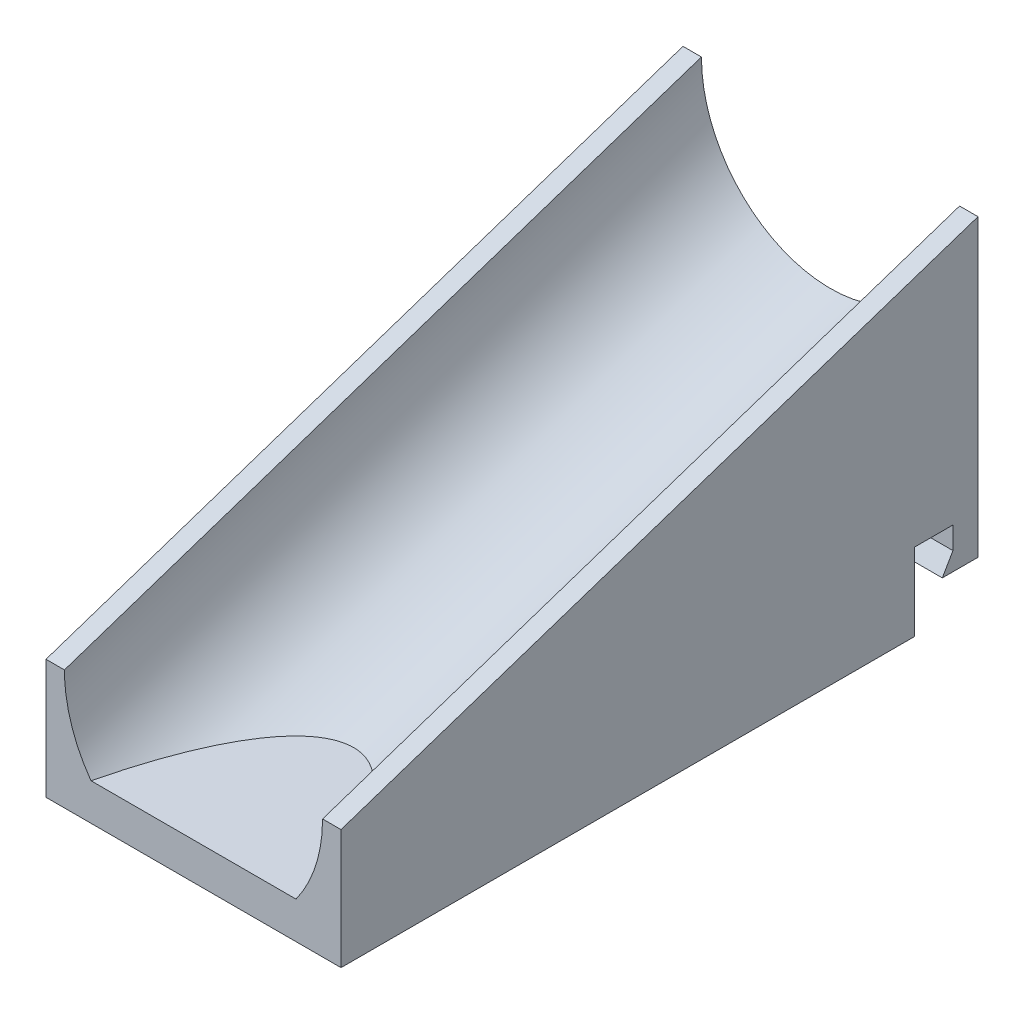
ISO-10303-21;
HEADER;
FILE_DESCRIPTION(('STEP AP214'),'2;1');
FILE_NAME('part.step','',(''),(''),'','','');
FILE_SCHEMA(('AUTOMOTIVE_DESIGN { 1 0 10303 214 1 1 1 1 }'));
ENDSEC;
DATA;
#1=APPLICATION_CONTEXT('core data for automotive mechanical design processes');
#2=APPLICATION_PROTOCOL_DEFINITION('international standard','automotive_design',2000,#1);
#3=PRODUCT_CONTEXT('',#1,'mechanical');
#4=PRODUCT('Part','Part','',(#3));
#5=PRODUCT_RELATED_PRODUCT_CATEGORY('part','',(#4));
#6=PRODUCT_DEFINITION_FORMATION('','',#4);
#7=PRODUCT_DEFINITION_CONTEXT('part definition',#1,'design');
#8=PRODUCT_DEFINITION('design','',#6,#7);
#9=PRODUCT_DEFINITION_SHAPE('','',#8);
#10=(LENGTH_UNIT() NAMED_UNIT(*) SI_UNIT(.MILLI.,.METRE.));
#11=(NAMED_UNIT(*) PLANE_ANGLE_UNIT() SI_UNIT($,.RADIAN.));
#12=(NAMED_UNIT(*) SI_UNIT($,.STERADIAN.) SOLID_ANGLE_UNIT());
#13=UNCERTAINTY_MEASURE_WITH_UNIT(LENGTH_MEASURE(1.E-05),#10,'distance_accuracy_value','');
#14=(GEOMETRIC_REPRESENTATION_CONTEXT(3) GLOBAL_UNCERTAINTY_ASSIGNED_CONTEXT((#13)) GLOBAL_UNIT_ASSIGNED_CONTEXT((#10,
#11,#12)) REPRESENTATION_CONTEXT('',''));
#15=CARTESIAN_POINT('',(0.,0.,0.));
#16=DIRECTION('',(0.,0.,1.));
#17=DIRECTION('',(1.,0.,0.));
#18=AXIS2_PLACEMENT_3D('',#15,#16,#17);
#19=CARTESIAN_POINT('',(-50.8,0.,8.63600000000002));
#20=DIRECTION('',(0.,0.,-1.));
#21=DIRECTION('',(-1.,0.,0.));
#22=AXIS2_PLACEMENT_3D('',#19,#20,#21);
#23=PLANE('',#22);
#24=DIRECTION('',(0.,1.,0.));
#25=VECTOR('',#24,1.);
#26=CARTESIAN_POINT('',(0.,101.6,8.63600000000001));
#27=LINE('',#26,#25);
#28=CARTESIAN_POINT('',(0.,6.32508864231611,8.63600000000001));
#29=VERTEX_POINT('',#28);
#30=CARTESIAN_POINT('',(0.,13.97,8.63600000000001));
#31=VERTEX_POINT('',#30);
#32=EDGE_CURVE('E69',#29,#31,#27,.T.);
#33=ORIENTED_EDGE('',*,*,#32,.F.);
#34=DIRECTION('',(1.,0.,0.));
#35=VECTOR('',#34,1.);
#36=CARTESIAN_POINT('',(-50.8,6.3250886423161,8.63600000000002));
#37=LINE('',#36,#35);
#38=CARTESIAN_POINT('',(101.6,6.32508864231613,8.636));
#39=VERTEX_POINT('',#38);
#40=EDGE_CURVE('E11',#29,#39,#37,.T.);
#41=ORIENTED_EDGE('',*,*,#40,.T.);
#42=DIRECTION('',(0.,1.,0.));
#43=VECTOR('',#42,1.);
#44=CARTESIAN_POINT('',(101.6,0.,8.636));
#45=LINE('',#44,#43);
#46=CARTESIAN_POINT('',(101.6,13.97,8.636));
#47=VERTEX_POINT('',#46);
#48=EDGE_CURVE('E60',#39,#47,#45,.T.);
#49=ORIENTED_EDGE('',*,*,#48,.T.);
#50=DIRECTION('',(1.,0.,0.));
#51=VECTOR('',#50,1.);
#52=CARTESIAN_POINT('',(-50.8,13.97,8.63600000000002));
#53=LINE('',#52,#51);
#54=EDGE_CURVE('E168',#31,#47,#53,.T.);
#55=ORIENTED_EDGE('',*,*,#54,.F.);
#56=EDGE_LOOP('',(#33,#41,#49,#55));
#57=FACE_BOUND('',#56,.T.);
#58=ADVANCED_FACE('F35',(#57),#23,.F.);
#59=CARTESIAN_POINT('',(0.,0.,304.8));
#60=DIRECTION('',(0.,-0.948683298050514,-0.316227766016838));
#61=DIRECTION('',(0.,0.316227766016838,-0.948683298050514));
#62=AXIS2_PLACEMENT_3D('',#59,#60,#61);
#63=PLANE('',#62);
#64=DIRECTION('',(0.,0.316227766016838,-0.948683298050514));
#65=VECTOR('',#64,1.);
#66=CARTESIAN_POINT('',(0.,0.,304.8));
#67=LINE('',#66,#65);
#68=CARTESIAN_POINT('',(0.,28.4777714986456,219.366685504063));
#69=VERTEX_POINT('',#68);
#70=CARTESIAN_POINT('',(0.,101.6,0.));
#71=VERTEX_POINT('',#70);
#72=EDGE_CURVE('E186',#69,#71,#67,.T.);
#73=ORIENTED_EDGE('',*,*,#72,.F.);
#74=DIRECTION('',(1.,0.,0.));
#75=VECTOR('',#74,1.);
#76=CARTESIAN_POINT('',(0.,28.4777714986456,219.366685504063));
#77=LINE('',#76,#75);
#78=CARTESIAN_POINT('',(6.35000000000002,28.4777714986456,219.366685504063));
#79=VERTEX_POINT('',#78);
#80=EDGE_CURVE('E153',#69,#79,#77,.T.);
#81=ORIENTED_EDGE('',*,*,#80,.T.);
#82=DIRECTION('',(0.,0.316227766016838,-0.948683298050514));
#83=VECTOR('',#82,1.);
#84=CARTESIAN_POINT('',(6.35000000000005,-59.0437051365537,481.931115409661));
#85=LINE('',#84,#83);
#86=CARTESIAN_POINT('',(6.34999999999999,101.6,0.));
#87=VERTEX_POINT('',#86);
#88=EDGE_CURVE('E209',#79,#87,#85,.T.);
#89=ORIENTED_EDGE('',*,*,#88,.T.);
#90=DIRECTION('',(-1.,0.,0.));
#91=VECTOR('',#90,1.);
#92=CARTESIAN_POINT('',(0.,101.6,0.));
#93=LINE('',#92,#91);
#94=EDGE_CURVE('E194',#87,#71,#93,.T.);
#95=ORIENTED_EDGE('',*,*,#94,.T.);
#96=EDGE_LOOP('',(#73,#81,#89,#95));
#97=FACE_BOUND('',#96,.T.);
#98=ADVANCED_FACE('F232',(#97),#63,.F.);
#99=CARTESIAN_POINT('',(0.,101.6,0.));
#100=DIRECTION('',(1.,0.,0.));
#101=DIRECTION('',(0.,0.,-1.));
#102=AXIS2_PLACEMENT_3D('',#99,#100,#101);
#103=PLANE('',#102);
#104=DIRECTION('',(0.,0.,-1.));
#105=VECTOR('',#104,1.);
#106=CARTESIAN_POINT('',(0.,-12.7,21.790000108));
#107=LINE('',#106,#105);
#108=CARTESIAN_POINT('',(0.,-12.7,219.366685504063));
#109=VERTEX_POINT('',#108);
#110=CARTESIAN_POINT('',(0.,-12.7,21.790000108));
#111=VERTEX_POINT('',#110);
#112=EDGE_CURVE('E152',#109,#111,#107,.T.);
#113=ORIENTED_EDGE('',*,*,#112,.F.);
#114=DIRECTION('',(0.,-1.,0.));
#115=VECTOR('',#114,1.);
#116=CARTESIAN_POINT('',(0.,45.72,219.366685504063));
#117=LINE('',#116,#115);
#118=EDGE_CURVE('E51',#69,#109,#117,.T.);
#119=ORIENTED_EDGE('',*,*,#118,.F.);
#120=ORIENTED_EDGE('',*,*,#72,.T.);
#121=DIRECTION('',(0.,-1.,0.));
#122=VECTOR('',#121,1.);
#123=CARTESIAN_POINT('',(0.,101.6,0.));
#124=LINE('',#123,#122);
#125=CARTESIAN_POINT('',(0.,0.,0.));
#126=VERTEX_POINT('',#125);
#127=EDGE_CURVE('E193',#71,#126,#124,.T.);
#128=ORIENTED_EDGE('',*,*,#127,.T.);
#129=DIRECTION('',(0.,0.,1.));
#130=VECTOR('',#129,1.);
#131=CARTESIAN_POINT('',(0.,0.,0.));
#132=LINE('',#131,#130);
#133=CARTESIAN_POINT('',(0.,0.,12.2877916302894));
#134=VERTEX_POINT('',#133);
#135=EDGE_CURVE('E188',#126,#134,#132,.T.);
#136=ORIENTED_EDGE('',*,*,#135,.T.);
#137=DIRECTION('',(0.,0.866025403784441,-0.499999999999996));
#138=VECTOR('',#137,1.);
#139=CARTESIAN_POINT('',(0.,-4.67343398574636,14.986));
#140=LINE('',#139,#138);
#141=EDGE_CURVE('E76',#134,#29,#140,.T.);
#142=ORIENTED_EDGE('',*,*,#141,.T.);
#143=ORIENTED_EDGE('',*,*,#32,.T.);
#144=DIRECTION('',(0.,0.,1.));
#145=VECTOR('',#144,1.);
#146=CARTESIAN_POINT('',(0.,13.97,0.));
#147=LINE('',#146,#145);
#148=CARTESIAN_POINT('',(0.,13.97,21.790000108));
#149=VERTEX_POINT('',#148);
#150=EDGE_CURVE('E177',#31,#149,#147,.T.);
#151=ORIENTED_EDGE('',*,*,#150,.T.);
#152=DIRECTION('',(0.,-1.,0.));
#153=VECTOR('',#152,1.);
#154=CARTESIAN_POINT('',(0.,101.6,21.7900001079999));
#155=LINE('',#154,#153);
#156=EDGE_CURVE('E174',#149,#111,#155,.T.);
#157=ORIENTED_EDGE('',*,*,#156,.T.);
#158=EDGE_LOOP('',(#113,#119,#120,#128,#136,#142,#143,#151,#157));
#159=FACE_BOUND('',#158,.T.);
#160=ADVANCED_FACE('F239',(#159),#103,.F.);
#161=CARTESIAN_POINT('',(101.6,101.6,0.));
#162=DIRECTION('',(-1.,0.,0.));
#163=DIRECTION('',(0.,0.,1.));
#164=AXIS2_PLACEMENT_3D('',#161,#162,#163);
#165=PLANE('',#164);
#166=DIRECTION('',(0.,0.316227766016838,-0.948683298050514));
#167=VECTOR('',#166,1.);
#168=CARTESIAN_POINT('',(101.6,0.,304.8));
#169=LINE('',#168,#167);
#170=CARTESIAN_POINT('',(101.6,28.4777714986456,219.366685504063));
#171=VERTEX_POINT('',#170);
#172=CARTESIAN_POINT('',(101.6,101.6,0.));
#173=VERTEX_POINT('',#172);
#174=EDGE_CURVE('E145',#171,#173,#169,.T.);
#175=ORIENTED_EDGE('',*,*,#174,.F.);
#176=DIRECTION('',(0.,-1.,0.));
#177=VECTOR('',#176,1.);
#178=CARTESIAN_POINT('',(101.6,45.72,219.366685504063));
#179=LINE('',#178,#177);
#180=CARTESIAN_POINT('',(101.6,-12.7,219.366685504063));
#181=VERTEX_POINT('',#180);
#182=EDGE_CURVE('E133',#171,#181,#179,.T.);
#183=ORIENTED_EDGE('',*,*,#182,.T.);
#184=DIRECTION('',(0.,0.,1.));
#185=VECTOR('',#184,1.);
#186=CARTESIAN_POINT('',(101.6,-12.7,21.790000108));
#187=LINE('',#186,#185);
#188=CARTESIAN_POINT('',(101.6,-12.7,21.790000108));
#189=VERTEX_POINT('',#188);
#190=EDGE_CURVE('E143',#189,#181,#187,.T.);
#191=ORIENTED_EDGE('',*,*,#190,.F.);
#192=DIRECTION('',(0.,-1.,0.));
#193=VECTOR('',#192,1.);
#194=CARTESIAN_POINT('',(101.6,0.,21.790000108));
#195=LINE('',#194,#193);
#196=CARTESIAN_POINT('',(101.6,13.97,21.790000108));
#197=VERTEX_POINT('',#196);
#198=EDGE_CURVE('E162',#197,#189,#195,.T.);
#199=ORIENTED_EDGE('',*,*,#198,.F.);
#200=DIRECTION('',(0.,0.,1.));
#201=VECTOR('',#200,1.);
#202=CARTESIAN_POINT('',(101.6,13.97,21.790000108));
#203=LINE('',#202,#201);
#204=EDGE_CURVE('E165',#47,#197,#203,.T.);
#205=ORIENTED_EDGE('',*,*,#204,.F.);
#206=ORIENTED_EDGE('',*,*,#48,.F.);
#207=DIRECTION('',(0.,-0.866025403784441,0.499999999999996));
#208=VECTOR('',#207,1.);
#209=CARTESIAN_POINT('',(101.6,-4.67343398574636,14.986));
#210=LINE('',#209,#208);
#211=CARTESIAN_POINT('',(101.6,0.,12.2877916302894));
#212=VERTEX_POINT('',#211);
#213=EDGE_CURVE('E44',#39,#212,#210,.T.);
#214=ORIENTED_EDGE('',*,*,#213,.T.);
#215=DIRECTION('',(0.,0.,-1.));
#216=VECTOR('',#215,1.);
#217=CARTESIAN_POINT('',(101.6,0.,0.));
#218=LINE('',#217,#216);
#219=CARTESIAN_POINT('',(101.6,0.,0.));
#220=VERTEX_POINT('',#219);
#221=EDGE_CURVE('E197',#212,#220,#218,.T.);
#222=ORIENTED_EDGE('',*,*,#221,.T.);
#223=DIRECTION('',(0.,-1.,0.));
#224=VECTOR('',#223,1.);
#225=CARTESIAN_POINT('',(101.6,101.6,0.));
#226=LINE('',#225,#224);
#227=EDGE_CURVE('E203',#173,#220,#226,.T.);
#228=ORIENTED_EDGE('',*,*,#227,.F.);
#229=EDGE_LOOP('',(#175,#183,#191,#199,#205,#206,#214,#222,#228));
#230=FACE_BOUND('',#229,.T.);
#231=ADVANCED_FACE('F141',(#230),#165,.F.);
#232=CARTESIAN_POINT('',(0.,101.6,0.));
#233=DIRECTION('',(0.,0.,1.));
#234=DIRECTION('',(1.,0.,0.));
#235=AXIS2_PLACEMENT_3D('',#232,#233,#234);
#236=PLANE('',#235);
#237=ORIENTED_EDGE('',*,*,#94,.F.);
#238=CARTESIAN_POINT('',(50.8,101.6,0.));
#239=DIRECTION('',(0.,0.,1.));
#240=DIRECTION('',(0.,1.,0.));
#241=AXIS2_PLACEMENT_3D('',#238,#239,#240);
#242=ELLIPSE('',#241,46.8544139981615,44.45);
#243=CARTESIAN_POINT('',(95.25,101.6,0.));
#244=VERTEX_POINT('',#243);
#245=EDGE_CURVE('E183',#87,#244,#242,.T.);
#246=ORIENTED_EDGE('',*,*,#245,.T.);
#247=EDGE_CURVE('E190',#173,#244,#93,.T.);
#248=ORIENTED_EDGE('',*,*,#247,.F.);
#249=ORIENTED_EDGE('',*,*,#227,.T.);
#250=DIRECTION('',(-1.,0.,0.));
#251=VECTOR('',#250,1.);
#252=CARTESIAN_POINT('',(0.,0.,0.));
#253=LINE('',#252,#251);
#254=EDGE_CURVE('E199',#220,#126,#253,.T.);
#255=ORIENTED_EDGE('',*,*,#254,.T.);
#256=ORIENTED_EDGE('',*,*,#127,.F.);
#257=EDGE_LOOP('',(#237,#246,#248,#249,#255,#256));
#258=FACE_BOUND('',#257,.T.);
#259=ADVANCED_FACE('F253',(#258),#236,.F.);
#260=CARTESIAN_POINT('',(0.,0.,0.));
#261=DIRECTION('',(0.,1.,0.));
#262=DIRECTION('',(0.,0.,1.));
#263=AXIS2_PLACEMENT_3D('',#260,#261,#262);
#264=PLANE('',#263);
#265=ORIENTED_EDGE('',*,*,#221,.F.);
#266=DIRECTION('',(-1.,0.,0.));
#267=VECTOR('',#266,1.);
#268=CARTESIAN_POINT('',(0.,0.,12.2877916302894));
#269=LINE('',#268,#267);
#270=EDGE_CURVE('E212',#212,#134,#269,.T.);
#271=ORIENTED_EDGE('',*,*,#270,.T.);
#272=ORIENTED_EDGE('',*,*,#135,.F.);
#273=ORIENTED_EDGE('',*,*,#254,.F.);
#274=EDGE_LOOP('',(#265,#271,#272,#273));
#275=FACE_BOUND('',#274,.T.);
#276=ADVANCED_FACE('F217',(#275),#264,.F.);
#277=DIRECTION('',(0.,0.316227766016838,-0.948683298050514));
#278=VECTOR('',#277,1.);
#279=CARTESIAN_POINT('',(95.2500000000001,-59.0437051365537,481.931115409661));
#280=LINE('',#279,#278);
#281=CARTESIAN_POINT('',(95.25,28.4777714986456,219.366685504063));
#282=VERTEX_POINT('',#281);
#283=EDGE_CURVE('E206',#244,#282,#280,.F.);
#284=ORIENTED_EDGE('',*,*,#283,.T.);
#285=DIRECTION('',(1.,0.,0.));
#286=VECTOR('',#285,1.);
#287=CARTESIAN_POINT('',(0.,28.4777714986456,219.366685504063));
#288=LINE('',#287,#286);
#289=EDGE_CURVE('E157',#282,#171,#288,.T.);
#290=ORIENTED_EDGE('',*,*,#289,.T.);
#291=ORIENTED_EDGE('',*,*,#174,.T.);
#292=ORIENTED_EDGE('',*,*,#247,.T.);
#293=EDGE_LOOP('',(#284,#290,#291,#292));
#294=FACE_BOUND('',#293,.T.);
#295=ADVANCED_FACE('F242',(#294),#63,.F.);
#296=CARTESIAN_POINT('',(50.8000000000001,-59.0437051365537,481.931115409661));
#297=DIRECTION('',(0.,0.316227766016838,-0.948683298050514));
#298=DIRECTION('',(0.,0.948683298050514,0.316227766016838));
#299=AXIS2_PLACEMENT_3D('',#296,#297,#298);
#300=CYLINDRICAL_SURFACE('',#299,44.45);
#301=ORIENTED_EDGE('',*,*,#88,.F.);
#302=CARTESIAN_POINT('',(50.8,28.4777714986456,219.366685504063));
#303=DIRECTION('',(0.,0.,-1.));
#304=DIRECTION('',(0.,1.,0.));
#305=AXIS2_PLACEMENT_3D('',#302,#303,#304);
#306=ELLIPSE('',#305,46.8544139981615,44.45);
#307=CARTESIAN_POINT('',(15.5024451636684,0.,219.366685504063));
#308=VERTEX_POINT('',#307);
#309=EDGE_CURVE('E371',#79,#308,#306,.F.);
#310=ORIENTED_EDGE('',*,*,#309,.T.);
#311=CARTESIAN_POINT('',(50.8,0.,304.8));
#312=DIRECTION('',(0.,1.,0.));
#313=DIRECTION('',(0.,0.,-1.));
#314=AXIS2_PLACEMENT_3D('',#311,#312,#313);
#315=ELLIPSE('',#314,140.563241994484,44.45);
#316=CARTESIAN_POINT('',(86.0975548363316,0.,219.366685504063));
#317=VERTEX_POINT('',#316);
#318=EDGE_CURVE('E180',#317,#308,#315,.T.);
#319=ORIENTED_EDGE('',*,*,#318,.F.);
#320=EDGE_CURVE('E373',#317,#282,#306,.F.);
#321=ORIENTED_EDGE('',*,*,#320,.T.);
#322=ORIENTED_EDGE('',*,*,#283,.F.);
#323=ORIENTED_EDGE('',*,*,#245,.F.);
#324=EDGE_LOOP('',(#301,#310,#319,#321,#322,#323));
#325=FACE_BOUND('',#324,.T.);
#326=ADVANCED_FACE('F245',(#325),#300,.F.);
#327=CARTESIAN_POINT('',(-50.8,13.97,21.790000108));
#328=DIRECTION('',(0.,1.,0.));
#329=DIRECTION('',(0.,0.,1.));
#330=AXIS2_PLACEMENT_3D('',#327,#328,#329);
#331=PLANE('',#330);
#332=ORIENTED_EDGE('',*,*,#54,.T.);
#333=ORIENTED_EDGE('',*,*,#204,.T.);
#334=DIRECTION('',(1.,0.,0.));
#335=VECTOR('',#334,1.);
#336=CARTESIAN_POINT('',(-50.8,13.97,21.790000108));
#337=LINE('',#336,#335);
#338=EDGE_CURVE('E169',#149,#197,#337,.T.);
#339=ORIENTED_EDGE('',*,*,#338,.F.);
#340=ORIENTED_EDGE('',*,*,#150,.F.);
#341=EDGE_LOOP('',(#332,#333,#339,#340));
#342=FACE_BOUND('',#341,.T.);
#343=ADVANCED_FACE('F228',(#342),#331,.F.);
#344=CARTESIAN_POINT('',(-50.8,0.,21.790000108));
#345=DIRECTION('',(0.,0.,1.));
#346=DIRECTION('',(0.,-1.,0.));
#347=AXIS2_PLACEMENT_3D('',#344,#345,#346);
#348=PLANE('',#347);
#349=ORIENTED_EDGE('',*,*,#338,.T.);
#350=ORIENTED_EDGE('',*,*,#198,.T.);
#351=DIRECTION('',(1.,0.,0.));
#352=VECTOR('',#351,1.);
#353=CARTESIAN_POINT('',(101.6,-12.7,21.790000108));
#354=LINE('',#353,#352);
#355=EDGE_CURVE('E151',#111,#189,#354,.T.);
#356=ORIENTED_EDGE('',*,*,#355,.F.);
#357=ORIENTED_EDGE('',*,*,#156,.F.);
#358=EDGE_LOOP('',(#349,#350,#356,#357));
#359=FACE_BOUND('',#358,.T.);
#360=ADVANCED_FACE('F221',(#359),#348,.F.);
#361=CARTESIAN_POINT('',(0.,-4.67343398574636,14.986));
#362=DIRECTION('',(0.,0.499999999999996,0.866025403784441));
#363=DIRECTION('',(1.,0.,0.));
#364=AXIS2_PLACEMENT_3D('',#361,#362,#363);
#365=PLANE('',#364);
#366=ORIENTED_EDGE('',*,*,#213,.F.);
#367=ORIENTED_EDGE('',*,*,#40,.F.);
#368=ORIENTED_EDGE('',*,*,#141,.F.);
#369=ORIENTED_EDGE('',*,*,#270,.F.);
#370=EDGE_LOOP('',(#366,#367,#368,#369));
#371=FACE_BOUND('',#370,.T.);
#372=ADVANCED_FACE('F38',(#371),#365,.T.);
#373=CARTESIAN_POINT('',(0.,0.,0.));
#374=DIRECTION('',(0.,-1.,0.));
#375=DIRECTION('',(0.,0.,-1.));
#376=AXIS2_PLACEMENT_3D('',#373,#374,#375);
#377=PLANE('',#376);
#378=ORIENTED_EDGE('',*,*,#318,.T.);
#379=DIRECTION('',(1.,0.,0.));
#380=VECTOR('',#379,1.);
#381=CARTESIAN_POINT('',(0.,0.,219.366685504063));
#382=LINE('',#381,#380);
#383=EDGE_CURVE('E146',#308,#317,#382,.T.);
#384=ORIENTED_EDGE('',*,*,#383,.T.);
#385=EDGE_LOOP('',(#378,#384));
#386=FACE_BOUND('',#385,.T.);
#387=ADVANCED_FACE('F220',(#386),#377,.F.);
#388=CARTESIAN_POINT('',(0.,-12.7,0.));
#389=DIRECTION('',(0.,-1.,0.));
#390=DIRECTION('',(0.,0.,-1.));
#391=AXIS2_PLACEMENT_3D('',#388,#389,#390);
#392=PLANE('',#391);
#393=DIRECTION('',(1.,0.,0.));
#394=VECTOR('',#393,1.);
#395=CARTESIAN_POINT('',(101.6,-12.7,219.366685504063));
#396=LINE('',#395,#394);
#397=EDGE_CURVE('E130',#109,#181,#396,.T.);
#398=ORIENTED_EDGE('',*,*,#397,.F.);
#399=ORIENTED_EDGE('',*,*,#112,.T.);
#400=ORIENTED_EDGE('',*,*,#355,.T.);
#401=ORIENTED_EDGE('',*,*,#190,.T.);
#402=EDGE_LOOP('',(#398,#399,#400,#401));
#403=FACE_BOUND('',#402,.T.);
#404=ADVANCED_FACE('F149',(#403),#392,.T.);
#405=CARTESIAN_POINT('',(101.6,45.72,219.366685504063));
#406=DIRECTION('',(0.,0.,-1.));
#407=DIRECTION('',(-1.,0.,0.));
#408=AXIS2_PLACEMENT_3D('',#405,#406,#407);
#409=PLANE('',#408);
#410=ORIENTED_EDGE('',*,*,#118,.T.);
#411=ORIENTED_EDGE('',*,*,#397,.T.);
#412=ORIENTED_EDGE('',*,*,#182,.F.);
#413=ORIENTED_EDGE('',*,*,#289,.F.);
#414=ORIENTED_EDGE('',*,*,#320,.F.);
#415=ORIENTED_EDGE('',*,*,#383,.F.);
#416=ORIENTED_EDGE('',*,*,#309,.F.);
#417=ORIENTED_EDGE('',*,*,#80,.F.);
#418=EDGE_LOOP('',(#410,#411,#412,#413,#414,#415,#416,#417));
#419=FACE_BOUND('',#418,.T.);
#420=ADVANCED_FACE('F132',(#419),#409,.F.);
#421=CLOSED_SHELL('',(#58,#98,#160,#231,#259,#276,#295,#326,#343,#360,#372,#387,#404,#420));
#422=MANIFOLD_SOLID_BREP('B2',#421);
#423=ADVANCED_BREP_SHAPE_REPRESENTATION('',(#18,#422),#14);
#424=SHAPE_DEFINITION_REPRESENTATION(#9,#423);
ENDSEC;
END-ISO-10303-21;
